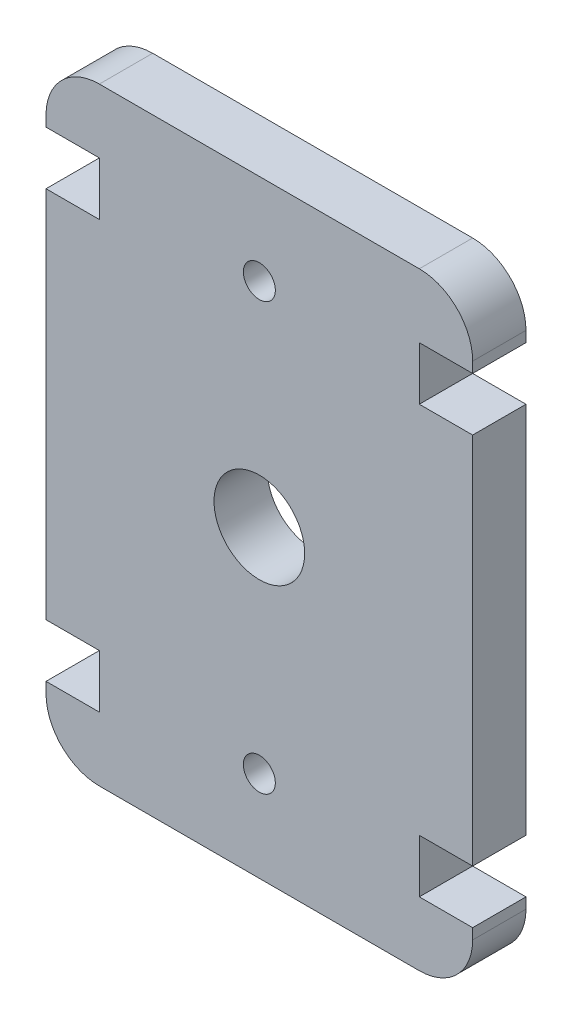
ISO-10303-21;
HEADER;
FILE_DESCRIPTION(('STEP AP214'),'2;1');
FILE_NAME('part.step','',(''),(''),'','','');
FILE_SCHEMA(('AUTOMOTIVE_DESIGN { 1 0 10303 214 1 1 1 1 }'));
ENDSEC;
DATA;
#1=APPLICATION_CONTEXT('core data for automotive mechanical design processes');
#2=APPLICATION_PROTOCOL_DEFINITION('international standard','automotive_design',2000,#1);
#3=PRODUCT_CONTEXT('',#1,'mechanical');
#4=PRODUCT('Part','Part','',(#3));
#5=PRODUCT_RELATED_PRODUCT_CATEGORY('part','',(#4));
#6=PRODUCT_DEFINITION_FORMATION('','',#4);
#7=PRODUCT_DEFINITION_CONTEXT('part definition',#1,'design');
#8=PRODUCT_DEFINITION('design','',#6,#7);
#9=PRODUCT_DEFINITION_SHAPE('','',#8);
#10=(LENGTH_UNIT() NAMED_UNIT(*) SI_UNIT(.MILLI.,.METRE.));
#11=(NAMED_UNIT(*) PLANE_ANGLE_UNIT() SI_UNIT($,.RADIAN.));
#12=(NAMED_UNIT(*) SI_UNIT($,.STERADIAN.) SOLID_ANGLE_UNIT());
#13=UNCERTAINTY_MEASURE_WITH_UNIT(LENGTH_MEASURE(1.E-05),#10,'distance_accuracy_value','');
#14=(GEOMETRIC_REPRESENTATION_CONTEXT(3) GLOBAL_UNCERTAINTY_ASSIGNED_CONTEXT((#13)) GLOBAL_UNIT_ASSIGNED_CONTEXT((#10,
#11,#12)) REPRESENTATION_CONTEXT('',''));
#15=CARTESIAN_POINT('',(0.,0.,0.));
#16=DIRECTION('',(0.,0.,1.));
#17=DIRECTION('',(1.,0.,0.));
#18=AXIS2_PLACEMENT_3D('',#15,#16,#17);
#19=CARTESIAN_POINT('',(0.,0.,5.));
#20=DIRECTION('',(0.,0.,1.));
#21=DIRECTION('',(1.,0.,0.));
#22=AXIS2_PLACEMENT_3D('',#19,#20,#21);
#23=PLANE('',#22);
#24=CARTESIAN_POINT('',(0.,8.50000000000009,5.));
#25=DIRECTION('',(0.,0.,1.));
#26=DIRECTION('',(1.,0.,0.));
#27=AXIS2_PLACEMENT_3D('',#24,#25,#26);
#28=CIRCLE('',#27,1.5);
#29=CARTESIAN_POINT('',(1.5,8.50000000000009,5.));
#30=VERTEX_POINT('',#29);
#31=EDGE_CURVE('E473',#30,#30,#28,.T.);
#32=ORIENTED_EDGE('',*,*,#31,.F.);
#33=EDGE_LOOP('',(#32));
#34=FACE_BOUND('',#33,.T.);
#35=DIRECTION('',(0.,1.,0.));
#36=VECTOR('',#35,1.);
#37=CARTESIAN_POINT('',(20.,51.,5.));
#38=LINE('',#37,#36);
#39=CARTESIAN_POINT('',(20.,51.,5.));
#40=VERTEX_POINT('',#39);
#41=CARTESIAN_POINT('',(20.,52.0000000000001,5.));
#42=VERTEX_POINT('',#41);
#43=EDGE_CURVE('E248',#40,#42,#38,.T.);
#44=ORIENTED_EDGE('',*,*,#43,.T.);
#45=CARTESIAN_POINT('',(15.,52.0000000000001,5.));
#46=DIRECTION('',(0.,0.,1.));
#47=DIRECTION('',(1.,0.,0.));
#48=AXIS2_PLACEMENT_3D('',#45,#46,#47);
#49=CIRCLE('',#48,5.);
#50=CARTESIAN_POINT('',(15.,57.0000000000001,5.));
#51=VERTEX_POINT('',#50);
#52=EDGE_CURVE('E429',#42,#51,#49,.T.);
#53=ORIENTED_EDGE('',*,*,#52,.T.);
#54=DIRECTION('',(-1.,0.,0.));
#55=VECTOR('',#54,1.);
#56=CARTESIAN_POINT('',(20.,57.0000000000001,5.));
#57=LINE('',#56,#55);
#58=CARTESIAN_POINT('',(-15.,57.0000000000001,5.));
#59=VERTEX_POINT('',#58);
#60=EDGE_CURVE('E251',#51,#59,#57,.T.);
#61=ORIENTED_EDGE('',*,*,#60,.T.);
#62=CARTESIAN_POINT('',(-15.,52.0000000000001,5.));
#63=DIRECTION('',(0.,0.,1.));
#64=DIRECTION('',(1.,0.,0.));
#65=AXIS2_PLACEMENT_3D('',#62,#63,#64);
#66=CIRCLE('',#65,5.);
#67=CARTESIAN_POINT('',(-20.,52.0000000000001,5.));
#68=VERTEX_POINT('',#67);
#69=EDGE_CURVE('E55',#59,#68,#66,.T.);
#70=ORIENTED_EDGE('',*,*,#69,.T.);
#71=DIRECTION('',(0.,-1.,0.));
#72=VECTOR('',#71,1.);
#73=CARTESIAN_POINT('',(-20.,57.0000000000001,5.));
#74=LINE('',#73,#72);
#75=CARTESIAN_POINT('',(-20.,51.,5.));
#76=VERTEX_POINT('',#75);
#77=EDGE_CURVE('E254',#68,#76,#74,.T.);
#78=ORIENTED_EDGE('',*,*,#77,.T.);
#79=DIRECTION('',(1.,0.,0.));
#80=VECTOR('',#79,1.);
#81=CARTESIAN_POINT('',(-20.,51.,5.));
#82=LINE('',#81,#80);
#83=CARTESIAN_POINT('',(-15.,51.,5.));
#84=VERTEX_POINT('',#83);
#85=EDGE_CURVE('E257',#76,#84,#82,.T.);
#86=ORIENTED_EDGE('',*,*,#85,.T.);
#87=DIRECTION('',(0.,-1.,0.));
#88=VECTOR('',#87,1.);
#89=CARTESIAN_POINT('',(-15.,51.,5.));
#90=LINE('',#89,#88);
#91=CARTESIAN_POINT('',(-15.,46.,5.));
#92=VERTEX_POINT('',#91);
#93=EDGE_CURVE('E260',#84,#92,#90,.T.);
#94=ORIENTED_EDGE('',*,*,#93,.T.);
#95=DIRECTION('',(-1.,0.,0.));
#96=VECTOR('',#95,1.);
#97=CARTESIAN_POINT('',(-15.,46.,5.));
#98=LINE('',#97,#96);
#99=CARTESIAN_POINT('',(-20.,46.,5.));
#100=VERTEX_POINT('',#99);
#101=EDGE_CURVE('E263',#92,#100,#98,.T.);
#102=ORIENTED_EDGE('',*,*,#101,.T.);
#103=DIRECTION('',(0.,-1.,0.));
#104=VECTOR('',#103,1.);
#105=CARTESIAN_POINT('',(-20.,46.,5.));
#106=LINE('',#105,#104);
#107=CARTESIAN_POINT('',(-20.,11.0000000000001,5.));
#108=VERTEX_POINT('',#107);
#109=EDGE_CURVE('E266',#100,#108,#106,.T.);
#110=ORIENTED_EDGE('',*,*,#109,.T.);
#111=DIRECTION('',(1.,0.,0.));
#112=VECTOR('',#111,1.);
#113=CARTESIAN_POINT('',(-20.,11.0000000000001,5.));
#114=LINE('',#113,#112);
#115=CARTESIAN_POINT('',(-15.,11.,5.));
#116=VERTEX_POINT('',#115);
#117=EDGE_CURVE('E269',#108,#116,#114,.T.);
#118=ORIENTED_EDGE('',*,*,#117,.T.);
#119=DIRECTION('',(0.,-1.,0.));
#120=VECTOR('',#119,1.);
#121=CARTESIAN_POINT('',(-15.,11.,5.));
#122=LINE('',#121,#120);
#123=CARTESIAN_POINT('',(-15.,6.,5.));
#124=VERTEX_POINT('',#123);
#125=EDGE_CURVE('E272',#116,#124,#122,.T.);
#126=ORIENTED_EDGE('',*,*,#125,.T.);
#127=DIRECTION('',(-1.,0.,0.));
#128=VECTOR('',#127,1.);
#129=CARTESIAN_POINT('',(-15.,6.,5.));
#130=LINE('',#129,#128);
#131=CARTESIAN_POINT('',(-20.,6.00000000000009,5.));
#132=VERTEX_POINT('',#131);
#133=EDGE_CURVE('E275',#124,#132,#130,.T.);
#134=ORIENTED_EDGE('',*,*,#133,.T.);
#135=DIRECTION('',(0.,-1.,0.));
#136=VECTOR('',#135,1.);
#137=CARTESIAN_POINT('',(-20.,6.00000000000009,5.));
#138=LINE('',#137,#136);
#139=CARTESIAN_POINT('',(-20.,5.,5.));
#140=VERTEX_POINT('',#139);
#141=EDGE_CURVE('E343',#132,#140,#138,.T.);
#142=ORIENTED_EDGE('',*,*,#141,.T.);
#143=CARTESIAN_POINT('',(-15.,5.,5.));
#144=DIRECTION('',(0.,0.,1.));
#145=DIRECTION('',(1.,0.,0.));
#146=AXIS2_PLACEMENT_3D('',#143,#144,#145);
#147=CIRCLE('',#146,5.);
#148=CARTESIAN_POINT('',(-15.,0.,5.));
#149=VERTEX_POINT('',#148);
#150=EDGE_CURVE('E424',#140,#149,#147,.T.);
#151=ORIENTED_EDGE('',*,*,#150,.T.);
#152=DIRECTION('',(1.,0.,0.));
#153=VECTOR('',#152,1.);
#154=CARTESIAN_POINT('',(-20.,0.,5.));
#155=LINE('',#154,#153);
#156=CARTESIAN_POINT('',(15.,0.,5.));
#157=VERTEX_POINT('',#156);
#158=EDGE_CURVE('E210',#149,#157,#155,.T.);
#159=ORIENTED_EDGE('',*,*,#158,.T.);
#160=CARTESIAN_POINT('',(15.,5.,5.));
#161=DIRECTION('',(0.,0.,1.));
#162=DIRECTION('',(1.,0.,0.));
#163=AXIS2_PLACEMENT_3D('',#160,#161,#162);
#164=CIRCLE('',#163,5.);
#165=CARTESIAN_POINT('',(20.,5.,5.));
#166=VERTEX_POINT('',#165);
#167=EDGE_CURVE('E62',#157,#166,#164,.T.);
#168=ORIENTED_EDGE('',*,*,#167,.T.);
#169=DIRECTION('',(0.,1.,0.));
#170=VECTOR('',#169,1.);
#171=CARTESIAN_POINT('',(20.,0.,5.));
#172=LINE('',#171,#170);
#173=CARTESIAN_POINT('',(20.,6.0000000000001,5.));
#174=VERTEX_POINT('',#173);
#175=EDGE_CURVE('E199',#166,#174,#172,.T.);
#176=ORIENTED_EDGE('',*,*,#175,.T.);
#177=DIRECTION('',(-1.,0.,0.));
#178=VECTOR('',#177,1.);
#179=CARTESIAN_POINT('',(20.,6.0000000000001,5.));
#180=LINE('',#179,#178);
#181=CARTESIAN_POINT('',(15.,6.,5.));
#182=VERTEX_POINT('',#181);
#183=EDGE_CURVE('E204',#174,#182,#180,.T.);
#184=ORIENTED_EDGE('',*,*,#183,.T.);
#185=DIRECTION('',(0.,1.,0.));
#186=VECTOR('',#185,1.);
#187=CARTESIAN_POINT('',(15.,6.,5.));
#188=LINE('',#187,#186);
#189=CARTESIAN_POINT('',(15.,11.,5.));
#190=VERTEX_POINT('',#189);
#191=EDGE_CURVE('E227',#182,#190,#188,.T.);
#192=ORIENTED_EDGE('',*,*,#191,.T.);
#193=DIRECTION('',(1.,0.,0.));
#194=VECTOR('',#193,1.);
#195=CARTESIAN_POINT('',(15.,11.,5.));
#196=LINE('',#195,#194);
#197=CARTESIAN_POINT('',(20.,11.0000000000001,5.));
#198=VERTEX_POINT('',#197);
#199=EDGE_CURVE('E230',#190,#198,#196,.T.);
#200=ORIENTED_EDGE('',*,*,#199,.T.);
#201=DIRECTION('',(0.,1.,0.));
#202=VECTOR('',#201,1.);
#203=CARTESIAN_POINT('',(20.,11.0000000000001,5.));
#204=LINE('',#203,#202);
#205=CARTESIAN_POINT('',(20.,46.,5.));
#206=VERTEX_POINT('',#205);
#207=EDGE_CURVE('E236',#198,#206,#204,.T.);
#208=ORIENTED_EDGE('',*,*,#207,.T.);
#209=DIRECTION('',(-1.,0.,0.));
#210=VECTOR('',#209,1.);
#211=CARTESIAN_POINT('',(20.,46.,5.));
#212=LINE('',#211,#210);
#213=CARTESIAN_POINT('',(15.,46.,5.));
#214=VERTEX_POINT('',#213);
#215=EDGE_CURVE('E239',#206,#214,#212,.T.);
#216=ORIENTED_EDGE('',*,*,#215,.T.);
#217=DIRECTION('',(0.,1.,0.));
#218=VECTOR('',#217,1.);
#219=CARTESIAN_POINT('',(15.,46.,5.));
#220=LINE('',#219,#218);
#221=CARTESIAN_POINT('',(15.,51.,5.));
#222=VERTEX_POINT('',#221);
#223=EDGE_CURVE('E242',#214,#222,#220,.T.);
#224=ORIENTED_EDGE('',*,*,#223,.T.);
#225=DIRECTION('',(1.,0.,0.));
#226=VECTOR('',#225,1.);
#227=CARTESIAN_POINT('',(15.,51.,5.));
#228=LINE('',#227,#226);
#229=EDGE_CURVE('E245',#222,#40,#228,.T.);
#230=ORIENTED_EDGE('',*,*,#229,.T.);
#231=EDGE_LOOP('',(#44,#53,#61,#70,#78,#86,#94,#102,#110,#118,#126,#134,#142,#151,#159,#168,
#176,#184,#192,#200,#208,#216,#224,#230));
#232=FACE_BOUND('',#231,.T.);
#233=CARTESIAN_POINT('',(0.,48.5,5.));
#234=DIRECTION('',(0.,0.,1.));
#235=DIRECTION('',(1.,0.,0.));
#236=AXIS2_PLACEMENT_3D('',#233,#234,#235);
#237=CIRCLE('',#236,1.5);
#238=CARTESIAN_POINT('',(1.5,48.5,5.));
#239=VERTEX_POINT('',#238);
#240=EDGE_CURVE('E284',#239,#239,#237,.T.);
#241=ORIENTED_EDGE('',*,*,#240,.F.);
#242=EDGE_LOOP('',(#241));
#243=FACE_BOUND('',#242,.T.);
#244=CARTESIAN_POINT('',(0.,28.5,5.));
#245=DIRECTION('',(0.,0.,1.));
#246=DIRECTION('',(1.,0.,0.));
#247=AXIS2_PLACEMENT_3D('',#244,#245,#246);
#248=CIRCLE('',#247,4.25);
#249=CARTESIAN_POINT('',(4.25,28.5,5.));
#250=VERTEX_POINT('',#249);
#251=EDGE_CURVE('E481',#250,#250,#248,.T.);
#252=ORIENTED_EDGE('',*,*,#251,.F.);
#253=EDGE_LOOP('',(#252));
#254=FACE_BOUND('',#253,.T.);
#255=ADVANCED_FACE('F39',(#34,#232,#243,#254),#23,.T.);
#256=CARTESIAN_POINT('',(0.,0.,0.));
#257=DIRECTION('',(0.,0.,1.));
#258=DIRECTION('',(1.,0.,0.));
#259=AXIS2_PLACEMENT_3D('',#256,#257,#258);
#260=PLANE('',#259);
#261=DIRECTION('',(-1.,0.,0.));
#262=VECTOR('',#261,1.);
#263=CARTESIAN_POINT('',(20.,57.0000000000001,0.));
#264=LINE('',#263,#262);
#265=CARTESIAN_POINT('',(15.,57.0000000000001,0.));
#266=VERTEX_POINT('',#265);
#267=CARTESIAN_POINT('',(-15.,57.0000000000001,0.));
#268=VERTEX_POINT('',#267);
#269=EDGE_CURVE('E315',#266,#268,#264,.T.);
#270=ORIENTED_EDGE('',*,*,#269,.F.);
#271=CARTESIAN_POINT('',(15.,52.0000000000001,0.));
#272=DIRECTION('',(0.,0.,1.));
#273=DIRECTION('',(1.,0.,0.));
#274=AXIS2_PLACEMENT_3D('',#271,#272,#273);
#275=CIRCLE('',#274,5.);
#276=CARTESIAN_POINT('',(20.,52.0000000000001,0.));
#277=VERTEX_POINT('',#276);
#278=EDGE_CURVE('E416',#266,#277,#275,.F.);
#279=ORIENTED_EDGE('',*,*,#278,.T.);
#280=DIRECTION('',(0.,1.,0.));
#281=VECTOR('',#280,1.);
#282=CARTESIAN_POINT('',(20.,51.,0.));
#283=LINE('',#282,#281);
#284=CARTESIAN_POINT('',(20.,51.,0.));
#285=VERTEX_POINT('',#284);
#286=EDGE_CURVE('E311',#285,#277,#283,.T.);
#287=ORIENTED_EDGE('',*,*,#286,.F.);
#288=DIRECTION('',(1.,0.,0.));
#289=VECTOR('',#288,1.);
#290=CARTESIAN_POINT('',(15.,51.,0.));
#291=LINE('',#290,#289);
#292=CARTESIAN_POINT('',(15.,51.,0.));
#293=VERTEX_POINT('',#292);
#294=EDGE_CURVE('E308',#293,#285,#291,.T.);
#295=ORIENTED_EDGE('',*,*,#294,.F.);
#296=DIRECTION('',(0.,1.,0.));
#297=VECTOR('',#296,1.);
#298=CARTESIAN_POINT('',(15.,46.,0.));
#299=LINE('',#298,#297);
#300=CARTESIAN_POINT('',(15.,46.,0.));
#301=VERTEX_POINT('',#300);
#302=EDGE_CURVE('E305',#301,#293,#299,.T.);
#303=ORIENTED_EDGE('',*,*,#302,.F.);
#304=DIRECTION('',(-1.,0.,0.));
#305=VECTOR('',#304,1.);
#306=CARTESIAN_POINT('',(20.,46.,0.));
#307=LINE('',#306,#305);
#308=CARTESIAN_POINT('',(20.,46.,0.));
#309=VERTEX_POINT('',#308);
#310=EDGE_CURVE('E302',#309,#301,#307,.T.);
#311=ORIENTED_EDGE('',*,*,#310,.F.);
#312=DIRECTION('',(0.,1.,0.));
#313=VECTOR('',#312,1.);
#314=CARTESIAN_POINT('',(20.,11.0000000000001,0.));
#315=LINE('',#314,#313);
#316=CARTESIAN_POINT('',(20.,11.0000000000001,0.));
#317=VERTEX_POINT('',#316);
#318=EDGE_CURVE('E299',#317,#309,#315,.T.);
#319=ORIENTED_EDGE('',*,*,#318,.F.);
#320=DIRECTION('',(1.,0.,0.));
#321=VECTOR('',#320,1.);
#322=CARTESIAN_POINT('',(15.,11.,0.));
#323=LINE('',#322,#321);
#324=CARTESIAN_POINT('',(15.,11.,0.));
#325=VERTEX_POINT('',#324);
#326=EDGE_CURVE('E296',#325,#317,#323,.T.);
#327=ORIENTED_EDGE('',*,*,#326,.F.);
#328=DIRECTION('',(0.,1.,0.));
#329=VECTOR('',#328,1.);
#330=CARTESIAN_POINT('',(15.,6.,0.));
#331=LINE('',#330,#329);
#332=CARTESIAN_POINT('',(15.,6.,0.));
#333=VERTEX_POINT('',#332);
#334=EDGE_CURVE('E293',#333,#325,#331,.T.);
#335=ORIENTED_EDGE('',*,*,#334,.F.);
#336=DIRECTION('',(-1.,0.,0.));
#337=VECTOR('',#336,1.);
#338=CARTESIAN_POINT('',(20.,6.0000000000001,0.));
#339=LINE('',#338,#337);
#340=CARTESIAN_POINT('',(20.,6.0000000000001,0.));
#341=VERTEX_POINT('',#340);
#342=EDGE_CURVE('E290',#341,#333,#339,.T.);
#343=ORIENTED_EDGE('',*,*,#342,.F.);
#344=DIRECTION('',(0.,1.,0.));
#345=VECTOR('',#344,1.);
#346=CARTESIAN_POINT('',(20.,0.,0.));
#347=LINE('',#346,#345);
#348=CARTESIAN_POINT('',(20.,5.,0.));
#349=VERTEX_POINT('',#348);
#350=EDGE_CURVE('E216',#349,#341,#347,.T.);
#351=ORIENTED_EDGE('',*,*,#350,.F.);
#352=CARTESIAN_POINT('',(15.,5.,0.));
#353=DIRECTION('',(0.,0.,1.));
#354=DIRECTION('',(1.,0.,0.));
#355=AXIS2_PLACEMENT_3D('',#352,#353,#354);
#356=CIRCLE('',#355,5.);
#357=CARTESIAN_POINT('',(15.,0.,0.));
#358=VERTEX_POINT('',#357);
#359=EDGE_CURVE('E413',#349,#358,#356,.F.);
#360=ORIENTED_EDGE('',*,*,#359,.T.);
#361=DIRECTION('',(1.,0.,0.));
#362=VECTOR('',#361,1.);
#363=CARTESIAN_POINT('',(-20.,0.,0.));
#364=LINE('',#363,#362);
#365=CARTESIAN_POINT('',(-15.,0.,0.));
#366=VERTEX_POINT('',#365);
#367=EDGE_CURVE('E283',#366,#358,#364,.T.);
#368=ORIENTED_EDGE('',*,*,#367,.F.);
#369=CARTESIAN_POINT('',(-15.,5.,0.));
#370=DIRECTION('',(0.,0.,1.));
#371=DIRECTION('',(1.,0.,0.));
#372=AXIS2_PLACEMENT_3D('',#369,#370,#371);
#373=CIRCLE('',#372,5.);
#374=CARTESIAN_POINT('',(-20.,5.,0.));
#375=VERTEX_POINT('',#374);
#376=EDGE_CURVE('E410',#366,#375,#373,.F.);
#377=ORIENTED_EDGE('',*,*,#376,.T.);
#378=DIRECTION('',(0.,-1.,0.));
#379=VECTOR('',#378,1.);
#380=CARTESIAN_POINT('',(-20.,6.00000000000009,0.));
#381=LINE('',#380,#379);
#382=CARTESIAN_POINT('',(-20.,6.00000000000009,0.));
#383=VERTEX_POINT('',#382);
#384=EDGE_CURVE('E279',#383,#375,#381,.T.);
#385=ORIENTED_EDGE('',*,*,#384,.F.);
#386=DIRECTION('',(-1.,0.,0.));
#387=VECTOR('',#386,1.);
#388=CARTESIAN_POINT('',(-15.,6.,0.));
#389=LINE('',#388,#387);
#390=CARTESIAN_POINT('',(-15.,6.,0.));
#391=VERTEX_POINT('',#390);
#392=EDGE_CURVE('E340',#391,#383,#389,.T.);
#393=ORIENTED_EDGE('',*,*,#392,.F.);
#394=DIRECTION('',(0.,-1.,0.));
#395=VECTOR('',#394,1.);
#396=CARTESIAN_POINT('',(-15.,11.,0.));
#397=LINE('',#396,#395);
#398=CARTESIAN_POINT('',(-15.,11.,0.));
#399=VERTEX_POINT('',#398);
#400=EDGE_CURVE('E337',#399,#391,#397,.T.);
#401=ORIENTED_EDGE('',*,*,#400,.F.);
#402=DIRECTION('',(1.,0.,0.));
#403=VECTOR('',#402,1.);
#404=CARTESIAN_POINT('',(-20.,11.0000000000001,0.));
#405=LINE('',#404,#403);
#406=CARTESIAN_POINT('',(-20.,11.0000000000001,0.));
#407=VERTEX_POINT('',#406);
#408=EDGE_CURVE('E334',#407,#399,#405,.T.);
#409=ORIENTED_EDGE('',*,*,#408,.F.);
#410=DIRECTION('',(0.,-1.,0.));
#411=VECTOR('',#410,1.);
#412=CARTESIAN_POINT('',(-20.,46.,0.));
#413=LINE('',#412,#411);
#414=CARTESIAN_POINT('',(-20.,46.,0.));
#415=VERTEX_POINT('',#414);
#416=EDGE_CURVE('E331',#415,#407,#413,.T.);
#417=ORIENTED_EDGE('',*,*,#416,.F.);
#418=DIRECTION('',(-1.,0.,0.));
#419=VECTOR('',#418,1.);
#420=CARTESIAN_POINT('',(-15.,46.,0.));
#421=LINE('',#420,#419);
#422=CARTESIAN_POINT('',(-15.,46.,0.));
#423=VERTEX_POINT('',#422);
#424=EDGE_CURVE('E328',#423,#415,#421,.T.);
#425=ORIENTED_EDGE('',*,*,#424,.F.);
#426=DIRECTION('',(0.,-1.,0.));
#427=VECTOR('',#426,1.);
#428=CARTESIAN_POINT('',(-15.,51.,0.));
#429=LINE('',#428,#427);
#430=CARTESIAN_POINT('',(-15.,51.,0.));
#431=VERTEX_POINT('',#430);
#432=EDGE_CURVE('E325',#431,#423,#429,.T.);
#433=ORIENTED_EDGE('',*,*,#432,.F.);
#434=DIRECTION('',(1.,0.,0.));
#435=VECTOR('',#434,1.);
#436=CARTESIAN_POINT('',(-20.,51.,0.));
#437=LINE('',#436,#435);
#438=CARTESIAN_POINT('',(-20.,51.,0.));
#439=VERTEX_POINT('',#438);
#440=EDGE_CURVE('E322',#439,#431,#437,.T.);
#441=ORIENTED_EDGE('',*,*,#440,.F.);
#442=DIRECTION('',(0.,-1.,0.));
#443=VECTOR('',#442,1.);
#444=CARTESIAN_POINT('',(-20.,57.0000000000001,0.));
#445=LINE('',#444,#443);
#446=CARTESIAN_POINT('',(-20.,52.0000000000001,0.));
#447=VERTEX_POINT('',#446);
#448=EDGE_CURVE('E319',#447,#439,#445,.T.);
#449=ORIENTED_EDGE('',*,*,#448,.F.);
#450=CARTESIAN_POINT('',(-15.,52.0000000000001,0.));
#451=DIRECTION('',(0.,0.,1.));
#452=DIRECTION('',(1.,0.,0.));
#453=AXIS2_PLACEMENT_3D('',#450,#451,#452);
#454=CIRCLE('',#453,5.);
#455=EDGE_CURVE('E407',#447,#268,#454,.F.);
#456=ORIENTED_EDGE('',*,*,#455,.T.);
#457=EDGE_LOOP('',(#270,#279,#287,#295,#303,#311,#319,#327,#335,#343,#351,#360,#368,#377,#385,
#393,#401,#409,#417,#425,#433,#441,#449,#456));
#458=FACE_BOUND('',#457,.T.);
#459=CARTESIAN_POINT('',(0.,48.5,0.));
#460=DIRECTION('',(0.,0.,1.));
#461=DIRECTION('',(1.,0.,0.));
#462=AXIS2_PLACEMENT_3D('',#459,#460,#461);
#463=CIRCLE('',#462,1.5);
#464=CARTESIAN_POINT('',(1.5,48.5,0.));
#465=VERTEX_POINT('',#464);
#466=EDGE_CURVE('E469',#465,#465,#463,.T.);
#467=ORIENTED_EDGE('',*,*,#466,.T.);
#468=EDGE_LOOP('',(#467));
#469=FACE_BOUND('',#468,.T.);
#470=CARTESIAN_POINT('',(0.,8.50000000000009,0.));
#471=DIRECTION('',(0.,0.,1.));
#472=DIRECTION('',(1.,0.,0.));
#473=AXIS2_PLACEMENT_3D('',#470,#471,#472);
#474=CIRCLE('',#473,1.5);
#475=CARTESIAN_POINT('',(1.5,8.50000000000009,0.));
#476=VERTEX_POINT('',#475);
#477=EDGE_CURVE('E477',#476,#476,#474,.T.);
#478=ORIENTED_EDGE('',*,*,#477,.T.);
#479=EDGE_LOOP('',(#478));
#480=FACE_BOUND('',#479,.T.);
#481=CARTESIAN_POINT('',(0.,28.5,0.));
#482=DIRECTION('',(0.,0.,1.));
#483=DIRECTION('',(1.,0.,0.));
#484=AXIS2_PLACEMENT_3D('',#481,#482,#483);
#485=CIRCLE('',#484,4.25);
#486=CARTESIAN_POINT('',(4.25,28.5,0.));
#487=VERTEX_POINT('',#486);
#488=EDGE_CURVE('E485',#487,#487,#485,.T.);
#489=ORIENTED_EDGE('',*,*,#488,.T.);
#490=EDGE_LOOP('',(#489));
#491=FACE_BOUND('',#490,.T.);
#492=ADVANCED_FACE('F463',(#458,#469,#480,#491),#260,.F.);
#493=CARTESIAN_POINT('',(-20.,6.00000000000009,5.));
#494=DIRECTION('',(1.,0.,0.));
#495=DIRECTION('',(0.,0.,-1.));
#496=AXIS2_PLACEMENT_3D('',#493,#494,#495);
#497=PLANE('',#496);
#498=ORIENTED_EDGE('',*,*,#384,.T.);
#499=DIRECTION('',(0.,0.,-1.));
#500=VECTOR('',#499,1.);
#501=CARTESIAN_POINT('',(-20.,5.,5.));
#502=LINE('',#501,#500);
#503=EDGE_CURVE('E48',#375,#140,#502,.F.);
#504=ORIENTED_EDGE('',*,*,#503,.T.);
#505=ORIENTED_EDGE('',*,*,#141,.F.);
#506=DIRECTION('',(0.,0.,-1.));
#507=VECTOR('',#506,1.);
#508=CARTESIAN_POINT('',(-20.,6.00000000000009,5.));
#509=LINE('',#508,#507);
#510=EDGE_CURVE('E278',#132,#383,#509,.T.);
#511=ORIENTED_EDGE('',*,*,#510,.T.);
#512=EDGE_LOOP('',(#498,#504,#505,#511));
#513=FACE_BOUND('',#512,.T.);
#514=ADVANCED_FACE('F446',(#513),#497,.F.);
#515=CARTESIAN_POINT('',(-20.,0.,5.));
#516=DIRECTION('',(0.,1.,0.));
#517=DIRECTION('',(0.,0.,1.));
#518=AXIS2_PLACEMENT_3D('',#515,#516,#517);
#519=PLANE('',#518);
#520=ORIENTED_EDGE('',*,*,#367,.T.);
#521=DIRECTION('',(0.,0.,-1.));
#522=VECTOR('',#521,1.);
#523=CARTESIAN_POINT('',(15.,0.,5.));
#524=LINE('',#523,#522);
#525=EDGE_CURVE('E439',#358,#157,#524,.F.);
#526=ORIENTED_EDGE('',*,*,#525,.T.);
#527=ORIENTED_EDGE('',*,*,#158,.F.);
#528=DIRECTION('',(0.,0.,-1.));
#529=VECTOR('',#528,1.);
#530=CARTESIAN_POINT('',(-15.,0.,5.));
#531=LINE('',#530,#529);
#532=EDGE_CURVE('E435',#149,#366,#531,.T.);
#533=ORIENTED_EDGE('',*,*,#532,.T.);
#534=EDGE_LOOP('',(#520,#526,#527,#533));
#535=FACE_BOUND('',#534,.T.);
#536=ADVANCED_FACE('F459',(#535),#519,.F.);
#537=CARTESIAN_POINT('',(20.,0.,5.));
#538=DIRECTION('',(-1.,0.,0.));
#539=DIRECTION('',(0.,0.,1.));
#540=AXIS2_PLACEMENT_3D('',#537,#538,#539);
#541=PLANE('',#540);
#542=ORIENTED_EDGE('',*,*,#175,.F.);
#543=DIRECTION('',(0.,0.,-1.));
#544=VECTOR('',#543,1.);
#545=CARTESIAN_POINT('',(20.,5.,5.));
#546=LINE('',#545,#544);
#547=EDGE_CURVE('E432',#166,#349,#546,.T.);
#548=ORIENTED_EDGE('',*,*,#547,.T.);
#549=ORIENTED_EDGE('',*,*,#350,.T.);
#550=DIRECTION('',(0.,0.,-1.));
#551=VECTOR('',#550,1.);
#552=CARTESIAN_POINT('',(20.,6.0000000000001,5.));
#553=LINE('',#552,#551);
#554=EDGE_CURVE('E213',#174,#341,#553,.T.);
#555=ORIENTED_EDGE('',*,*,#554,.F.);
#556=EDGE_LOOP('',(#542,#548,#549,#555));
#557=FACE_BOUND('',#556,.T.);
#558=ADVANCED_FACE('F214',(#557),#541,.F.);
#559=CARTESIAN_POINT('',(20.,6.0000000000001,5.));
#560=DIRECTION('',(0.,-1.,0.));
#561=DIRECTION('',(1.,0.,0.));
#562=AXIS2_PLACEMENT_3D('',#559,#560,#561);
#563=PLANE('',#562);
#564=ORIENTED_EDGE('',*,*,#342,.T.);
#565=DIRECTION('',(0.,0.,-1.));
#566=VECTOR('',#565,1.);
#567=CARTESIAN_POINT('',(15.,6.,5.));
#568=LINE('',#567,#566);
#569=EDGE_CURVE('E221',#182,#333,#568,.T.);
#570=ORIENTED_EDGE('',*,*,#569,.F.);
#571=ORIENTED_EDGE('',*,*,#183,.F.);
#572=ORIENTED_EDGE('',*,*,#554,.T.);
#573=EDGE_LOOP('',(#564,#570,#571,#572));
#574=FACE_BOUND('',#573,.T.);
#575=ADVANCED_FACE('F223',(#574),#563,.F.);
#576=CARTESIAN_POINT('',(15.,6.,5.));
#577=DIRECTION('',(-1.,0.,0.));
#578=DIRECTION('',(0.,0.,1.));
#579=AXIS2_PLACEMENT_3D('',#576,#577,#578);
#580=PLANE('',#579);
#581=ORIENTED_EDGE('',*,*,#334,.T.);
#582=DIRECTION('',(0.,0.,-1.));
#583=VECTOR('',#582,1.);
#584=CARTESIAN_POINT('',(15.,11.,5.));
#585=LINE('',#584,#583);
#586=EDGE_CURVE('E395',#190,#325,#585,.T.);
#587=ORIENTED_EDGE('',*,*,#586,.F.);
#588=ORIENTED_EDGE('',*,*,#191,.F.);
#589=ORIENTED_EDGE('',*,*,#569,.T.);
#590=EDGE_LOOP('',(#581,#587,#588,#589));
#591=FACE_BOUND('',#590,.T.);
#592=ADVANCED_FACE('F567',(#591),#580,.F.);
#593=CARTESIAN_POINT('',(15.,11.,5.));
#594=DIRECTION('',(0.,1.,0.));
#595=DIRECTION('',(-1.,0.,0.));
#596=AXIS2_PLACEMENT_3D('',#593,#594,#595);
#597=PLANE('',#596);
#598=ORIENTED_EDGE('',*,*,#326,.T.);
#599=DIRECTION('',(0.,0.,-1.));
#600=VECTOR('',#599,1.);
#601=CARTESIAN_POINT('',(20.,11.0000000000001,5.));
#602=LINE('',#601,#600);
#603=EDGE_CURVE('E391',#198,#317,#602,.T.);
#604=ORIENTED_EDGE('',*,*,#603,.F.);
#605=ORIENTED_EDGE('',*,*,#199,.F.);
#606=ORIENTED_EDGE('',*,*,#586,.T.);
#607=EDGE_LOOP('',(#598,#604,#605,#606));
#608=FACE_BOUND('',#607,.T.);
#609=ADVANCED_FACE('F563',(#608),#597,.F.);
#610=CARTESIAN_POINT('',(20.,11.0000000000001,5.));
#611=DIRECTION('',(-1.,0.,0.));
#612=DIRECTION('',(0.,0.,1.));
#613=AXIS2_PLACEMENT_3D('',#610,#611,#612);
#614=PLANE('',#613);
#615=ORIENTED_EDGE('',*,*,#318,.T.);
#616=DIRECTION('',(0.,0.,-1.));
#617=VECTOR('',#616,1.);
#618=CARTESIAN_POINT('',(20.,46.,5.));
#619=LINE('',#618,#617);
#620=EDGE_CURVE('E387',#206,#309,#619,.T.);
#621=ORIENTED_EDGE('',*,*,#620,.F.);
#622=ORIENTED_EDGE('',*,*,#207,.F.);
#623=ORIENTED_EDGE('',*,*,#603,.T.);
#624=EDGE_LOOP('',(#615,#621,#622,#623));
#625=FACE_BOUND('',#624,.T.);
#626=ADVANCED_FACE('F559',(#625),#614,.F.);
#627=CARTESIAN_POINT('',(20.,46.,5.));
#628=DIRECTION('',(0.,-1.,0.));
#629=DIRECTION('',(0.,0.,-1.));
#630=AXIS2_PLACEMENT_3D('',#627,#628,#629);
#631=PLANE('',#630);
#632=ORIENTED_EDGE('',*,*,#310,.T.);
#633=DIRECTION('',(0.,0.,-1.));
#634=VECTOR('',#633,1.);
#635=CARTESIAN_POINT('',(15.,46.,5.));
#636=LINE('',#635,#634);
#637=EDGE_CURVE('E383',#214,#301,#636,.T.);
#638=ORIENTED_EDGE('',*,*,#637,.F.);
#639=ORIENTED_EDGE('',*,*,#215,.F.);
#640=ORIENTED_EDGE('',*,*,#620,.T.);
#641=EDGE_LOOP('',(#632,#638,#639,#640));
#642=FACE_BOUND('',#641,.T.);
#643=ADVANCED_FACE('F555',(#642),#631,.F.);
#644=CARTESIAN_POINT('',(15.,46.,5.));
#645=DIRECTION('',(-1.,0.,0.));
#646=DIRECTION('',(0.,0.,1.));
#647=AXIS2_PLACEMENT_3D('',#644,#645,#646);
#648=PLANE('',#647);
#649=ORIENTED_EDGE('',*,*,#302,.T.);
#650=DIRECTION('',(0.,0.,-1.));
#651=VECTOR('',#650,1.);
#652=CARTESIAN_POINT('',(15.,51.,5.));
#653=LINE('',#652,#651);
#654=EDGE_CURVE('E379',#222,#293,#653,.T.);
#655=ORIENTED_EDGE('',*,*,#654,.F.);
#656=ORIENTED_EDGE('',*,*,#223,.F.);
#657=ORIENTED_EDGE('',*,*,#637,.T.);
#658=EDGE_LOOP('',(#649,#655,#656,#657));
#659=FACE_BOUND('',#658,.T.);
#660=ADVANCED_FACE('F551',(#659),#648,.F.);
#661=CARTESIAN_POINT('',(15.,51.,5.));
#662=DIRECTION('',(0.,1.,0.));
#663=DIRECTION('',(-1.,0.,0.));
#664=AXIS2_PLACEMENT_3D('',#661,#662,#663);
#665=PLANE('',#664);
#666=ORIENTED_EDGE('',*,*,#294,.T.);
#667=DIRECTION('',(0.,0.,-1.));
#668=VECTOR('',#667,1.);
#669=CARTESIAN_POINT('',(20.,51.,5.));
#670=LINE('',#669,#668);
#671=EDGE_CURVE('E375',#40,#285,#670,.T.);
#672=ORIENTED_EDGE('',*,*,#671,.F.);
#673=ORIENTED_EDGE('',*,*,#229,.F.);
#674=ORIENTED_EDGE('',*,*,#654,.T.);
#675=EDGE_LOOP('',(#666,#672,#673,#674));
#676=FACE_BOUND('',#675,.T.);
#677=ADVANCED_FACE('F547',(#676),#665,.F.);
#678=CARTESIAN_POINT('',(20.,51.,5.));
#679=DIRECTION('',(-1.,0.,0.));
#680=DIRECTION('',(0.,0.,1.));
#681=AXIS2_PLACEMENT_3D('',#678,#679,#680);
#682=PLANE('',#681);
#683=ORIENTED_EDGE('',*,*,#286,.T.);
#684=DIRECTION('',(0.,0.,-1.));
#685=VECTOR('',#684,1.);
#686=CARTESIAN_POINT('',(20.,52.0000000000001,5.));
#687=LINE('',#686,#685);
#688=EDGE_CURVE('E419',#277,#42,#687,.F.);
#689=ORIENTED_EDGE('',*,*,#688,.T.);
#690=ORIENTED_EDGE('',*,*,#43,.F.);
#691=ORIENTED_EDGE('',*,*,#671,.T.);
#692=EDGE_LOOP('',(#683,#689,#690,#691));
#693=FACE_BOUND('',#692,.T.);
#694=ADVANCED_FACE('F543',(#693),#682,.F.);
#695=CARTESIAN_POINT('',(20.,57.0000000000001,5.));
#696=DIRECTION('',(0.,-1.,0.));
#697=DIRECTION('',(0.,0.,-1.));
#698=AXIS2_PLACEMENT_3D('',#695,#696,#697);
#699=PLANE('',#698);
#700=ORIENTED_EDGE('',*,*,#60,.F.);
#701=DIRECTION('',(0.,0.,-1.));
#702=VECTOR('',#701,1.);
#703=CARTESIAN_POINT('',(15.,57.0000000000001,5.));
#704=LINE('',#703,#702);
#705=EDGE_CURVE('E403',#51,#266,#704,.T.);
#706=ORIENTED_EDGE('',*,*,#705,.T.);
#707=ORIENTED_EDGE('',*,*,#269,.T.);
#708=DIRECTION('',(0.,0.,-1.));
#709=VECTOR('',#708,1.);
#710=CARTESIAN_POINT('',(-15.,57.0000000000001,5.));
#711=LINE('',#710,#709);
#712=EDGE_CURVE('E220',#268,#59,#711,.F.);
#713=ORIENTED_EDGE('',*,*,#712,.T.);
#714=EDGE_LOOP('',(#700,#706,#707,#713));
#715=FACE_BOUND('',#714,.T.);
#716=ADVANCED_FACE('F539',(#715),#699,.F.);
#717=CARTESIAN_POINT('',(-20.,57.0000000000001,5.));
#718=DIRECTION('',(1.,0.,0.));
#719=DIRECTION('',(0.,0.,-1.));
#720=AXIS2_PLACEMENT_3D('',#717,#718,#719);
#721=PLANE('',#720);
#722=ORIENTED_EDGE('',*,*,#77,.F.);
#723=DIRECTION('',(0.,0.,-1.));
#724=VECTOR('',#723,1.);
#725=CARTESIAN_POINT('',(-20.,52.0000000000001,5.));
#726=LINE('',#725,#724);
#727=EDGE_CURVE('E11',#68,#447,#726,.T.);
#728=ORIENTED_EDGE('',*,*,#727,.T.);
#729=ORIENTED_EDGE('',*,*,#448,.T.);
#730=DIRECTION('',(0.,0.,-1.));
#731=VECTOR('',#730,1.);
#732=CARTESIAN_POINT('',(-20.,51.,5.));
#733=LINE('',#732,#731);
#734=EDGE_CURVE('E371',#76,#439,#733,.T.);
#735=ORIENTED_EDGE('',*,*,#734,.F.);
#736=EDGE_LOOP('',(#722,#728,#729,#735));
#737=FACE_BOUND('',#736,.T.);
#738=ADVANCED_FACE('F535',(#737),#721,.F.);
#739=CARTESIAN_POINT('',(-20.,51.,5.));
#740=DIRECTION('',(0.,1.,0.));
#741=DIRECTION('',(-1.,0.,0.));
#742=AXIS2_PLACEMENT_3D('',#739,#740,#741);
#743=PLANE('',#742);
#744=ORIENTED_EDGE('',*,*,#440,.T.);
#745=DIRECTION('',(0.,0.,-1.));
#746=VECTOR('',#745,1.);
#747=CARTESIAN_POINT('',(-15.,51.,5.));
#748=LINE('',#747,#746);
#749=EDGE_CURVE('E367',#84,#431,#748,.T.);
#750=ORIENTED_EDGE('',*,*,#749,.F.);
#751=ORIENTED_EDGE('',*,*,#85,.F.);
#752=ORIENTED_EDGE('',*,*,#734,.T.);
#753=EDGE_LOOP('',(#744,#750,#751,#752));
#754=FACE_BOUND('',#753,.T.);
#755=ADVANCED_FACE('F531',(#754),#743,.F.);
#756=CARTESIAN_POINT('',(-15.,51.,5.));
#757=DIRECTION('',(1.,0.,0.));
#758=DIRECTION('',(0.,0.,-1.));
#759=AXIS2_PLACEMENT_3D('',#756,#757,#758);
#760=PLANE('',#759);
#761=ORIENTED_EDGE('',*,*,#432,.T.);
#762=DIRECTION('',(0.,0.,-1.));
#763=VECTOR('',#762,1.);
#764=CARTESIAN_POINT('',(-15.,46.,5.));
#765=LINE('',#764,#763);
#766=EDGE_CURVE('E363',#92,#423,#765,.T.);
#767=ORIENTED_EDGE('',*,*,#766,.F.);
#768=ORIENTED_EDGE('',*,*,#93,.F.);
#769=ORIENTED_EDGE('',*,*,#749,.T.);
#770=EDGE_LOOP('',(#761,#767,#768,#769));
#771=FACE_BOUND('',#770,.T.);
#772=ADVANCED_FACE('F527',(#771),#760,.F.);
#773=CARTESIAN_POINT('',(-15.,46.,5.));
#774=DIRECTION('',(0.,-1.,0.));
#775=DIRECTION('',(0.,0.,-1.));
#776=AXIS2_PLACEMENT_3D('',#773,#774,#775);
#777=PLANE('',#776);
#778=ORIENTED_EDGE('',*,*,#424,.T.);
#779=DIRECTION('',(0.,0.,-1.));
#780=VECTOR('',#779,1.);
#781=CARTESIAN_POINT('',(-20.,46.,5.));
#782=LINE('',#781,#780);
#783=EDGE_CURVE('E359',#100,#415,#782,.T.);
#784=ORIENTED_EDGE('',*,*,#783,.F.);
#785=ORIENTED_EDGE('',*,*,#101,.F.);
#786=ORIENTED_EDGE('',*,*,#766,.T.);
#787=EDGE_LOOP('',(#778,#784,#785,#786));
#788=FACE_BOUND('',#787,.T.);
#789=ADVANCED_FACE('F523',(#788),#777,.F.);
#790=CARTESIAN_POINT('',(-20.,46.,5.));
#791=DIRECTION('',(1.,0.,0.));
#792=DIRECTION('',(0.,0.,-1.));
#793=AXIS2_PLACEMENT_3D('',#790,#791,#792);
#794=PLANE('',#793);
#795=ORIENTED_EDGE('',*,*,#416,.T.);
#796=DIRECTION('',(0.,0.,-1.));
#797=VECTOR('',#796,1.);
#798=CARTESIAN_POINT('',(-20.,11.0000000000001,5.));
#799=LINE('',#798,#797);
#800=EDGE_CURVE('E355',#108,#407,#799,.T.);
#801=ORIENTED_EDGE('',*,*,#800,.F.);
#802=ORIENTED_EDGE('',*,*,#109,.F.);
#803=ORIENTED_EDGE('',*,*,#783,.T.);
#804=EDGE_LOOP('',(#795,#801,#802,#803));
#805=FACE_BOUND('',#804,.T.);
#806=ADVANCED_FACE('F519',(#805),#794,.F.);
#807=CARTESIAN_POINT('',(-20.,11.0000000000001,5.));
#808=DIRECTION('',(0.,1.,0.));
#809=DIRECTION('',(-1.,0.,0.));
#810=AXIS2_PLACEMENT_3D('',#807,#808,#809);
#811=PLANE('',#810);
#812=ORIENTED_EDGE('',*,*,#408,.T.);
#813=DIRECTION('',(0.,0.,-1.));
#814=VECTOR('',#813,1.);
#815=CARTESIAN_POINT('',(-15.,11.,5.));
#816=LINE('',#815,#814);
#817=EDGE_CURVE('E351',#116,#399,#816,.T.);
#818=ORIENTED_EDGE('',*,*,#817,.F.);
#819=ORIENTED_EDGE('',*,*,#117,.F.);
#820=ORIENTED_EDGE('',*,*,#800,.T.);
#821=EDGE_LOOP('',(#812,#818,#819,#820));
#822=FACE_BOUND('',#821,.T.);
#823=ADVANCED_FACE('F515',(#822),#811,.F.);
#824=CARTESIAN_POINT('',(-15.,11.,5.));
#825=DIRECTION('',(1.,0.,0.));
#826=DIRECTION('',(0.,0.,-1.));
#827=AXIS2_PLACEMENT_3D('',#824,#825,#826);
#828=PLANE('',#827);
#829=ORIENTED_EDGE('',*,*,#400,.T.);
#830=DIRECTION('',(0.,0.,-1.));
#831=VECTOR('',#830,1.);
#832=CARTESIAN_POINT('',(-15.,6.,5.));
#833=LINE('',#832,#831);
#834=EDGE_CURVE('E347',#124,#391,#833,.T.);
#835=ORIENTED_EDGE('',*,*,#834,.F.);
#836=ORIENTED_EDGE('',*,*,#125,.F.);
#837=ORIENTED_EDGE('',*,*,#817,.T.);
#838=EDGE_LOOP('',(#829,#835,#836,#837));
#839=FACE_BOUND('',#838,.T.);
#840=ADVANCED_FACE('F511',(#839),#828,.F.);
#841=CARTESIAN_POINT('',(-15.,6.,5.));
#842=DIRECTION('',(0.,-1.,0.));
#843=DIRECTION('',(1.,0.,0.));
#844=AXIS2_PLACEMENT_3D('',#841,#842,#843);
#845=PLANE('',#844);
#846=ORIENTED_EDGE('',*,*,#392,.T.);
#847=ORIENTED_EDGE('',*,*,#510,.F.);
#848=ORIENTED_EDGE('',*,*,#133,.F.);
#849=ORIENTED_EDGE('',*,*,#834,.T.);
#850=EDGE_LOOP('',(#846,#847,#848,#849));
#851=FACE_BOUND('',#850,.T.);
#852=ADVANCED_FACE('F508',(#851),#845,.F.);
#853=CARTESIAN_POINT('',(0.,48.5,5.));
#854=DIRECTION('',(0.,0.,-1.));
#855=DIRECTION('',(-1.,0.,0.));
#856=AXIS2_PLACEMENT_3D('',#853,#854,#855);
#857=CYLINDRICAL_SURFACE('',#856,1.5);
#858=ORIENTED_EDGE('',*,*,#240,.T.);
#859=EDGE_LOOP('',(#858));
#860=FACE_BOUND('',#859,.T.);
#861=ORIENTED_EDGE('',*,*,#466,.F.);
#862=EDGE_LOOP('',(#861));
#863=FACE_BOUND('',#862,.T.);
#864=ADVANCED_FACE('F505',(#860,#863),#857,.F.);
#865=CARTESIAN_POINT('',(0.,8.50000000000009,5.));
#866=DIRECTION('',(0.,0.,-1.));
#867=DIRECTION('',(-1.,0.,0.));
#868=AXIS2_PLACEMENT_3D('',#865,#866,#867);
#869=CYLINDRICAL_SURFACE('',#868,1.5);
#870=ORIENTED_EDGE('',*,*,#31,.T.);
#871=EDGE_LOOP('',(#870));
#872=FACE_BOUND('',#871,.T.);
#873=ORIENTED_EDGE('',*,*,#477,.F.);
#874=EDGE_LOOP('',(#873));
#875=FACE_BOUND('',#874,.T.);
#876=ADVANCED_FACE('F712',(#872,#875),#869,.F.);
#877=CARTESIAN_POINT('',(0.,28.5,5.));
#878=DIRECTION('',(0.,0.,-1.));
#879=DIRECTION('',(-1.,0.,0.));
#880=AXIS2_PLACEMENT_3D('',#877,#878,#879);
#881=CYLINDRICAL_SURFACE('',#880,4.25);
#882=ORIENTED_EDGE('',*,*,#251,.T.);
#883=EDGE_LOOP('',(#882));
#884=FACE_BOUND('',#883,.T.);
#885=ORIENTED_EDGE('',*,*,#488,.F.);
#886=EDGE_LOOP('',(#885));
#887=FACE_BOUND('',#886,.T.);
#888=ADVANCED_FACE('F493',(#884,#887),#881,.F.);
#889=CARTESIAN_POINT('',(15.,52.0000000000001,5.));
#890=DIRECTION('',(0.,0.,-1.));
#891=DIRECTION('',(-1.,0.,0.));
#892=AXIS2_PLACEMENT_3D('',#889,#890,#891);
#893=CYLINDRICAL_SURFACE('',#892,5.);
#894=ORIENTED_EDGE('',*,*,#52,.F.);
#895=ORIENTED_EDGE('',*,*,#688,.F.);
#896=ORIENTED_EDGE('',*,*,#278,.F.);
#897=ORIENTED_EDGE('',*,*,#705,.F.);
#898=EDGE_LOOP('',(#894,#895,#896,#897));
#899=FACE_BOUND('',#898,.T.);
#900=ADVANCED_FACE('F580',(#899),#893,.T.);
#901=CARTESIAN_POINT('',(15.,5.,5.));
#902=DIRECTION('',(0.,0.,-1.));
#903=DIRECTION('',(-1.,0.,0.));
#904=AXIS2_PLACEMENT_3D('',#901,#902,#903);
#905=CYLINDRICAL_SURFACE('',#904,5.);
#906=ORIENTED_EDGE('',*,*,#167,.F.);
#907=ORIENTED_EDGE('',*,*,#525,.F.);
#908=ORIENTED_EDGE('',*,*,#359,.F.);
#909=ORIENTED_EDGE('',*,*,#547,.F.);
#910=EDGE_LOOP('',(#906,#907,#908,#909));
#911=FACE_BOUND('',#910,.T.);
#912=ADVANCED_FACE('F466',(#911),#905,.T.);
#913=CARTESIAN_POINT('',(-15.,5.,5.));
#914=DIRECTION('',(0.,0.,-1.));
#915=DIRECTION('',(-1.,0.,0.));
#916=AXIS2_PLACEMENT_3D('',#913,#914,#915);
#917=CYLINDRICAL_SURFACE('',#916,5.);
#918=ORIENTED_EDGE('',*,*,#150,.F.);
#919=ORIENTED_EDGE('',*,*,#503,.F.);
#920=ORIENTED_EDGE('',*,*,#376,.F.);
#921=ORIENTED_EDGE('',*,*,#532,.F.);
#922=EDGE_LOOP('',(#918,#919,#920,#921));
#923=FACE_BOUND('',#922,.T.);
#924=ADVANCED_FACE('F456',(#923),#917,.T.);
#925=CARTESIAN_POINT('',(-15.,52.0000000000001,5.));
#926=DIRECTION('',(0.,0.,-1.));
#927=DIRECTION('',(-1.,0.,0.));
#928=AXIS2_PLACEMENT_3D('',#925,#926,#927);
#929=CYLINDRICAL_SURFACE('',#928,5.);
#930=ORIENTED_EDGE('',*,*,#69,.F.);
#931=ORIENTED_EDGE('',*,*,#712,.F.);
#932=ORIENTED_EDGE('',*,*,#455,.F.);
#933=ORIENTED_EDGE('',*,*,#727,.F.);
#934=EDGE_LOOP('',(#930,#931,#932,#933));
#935=FACE_BOUND('',#934,.T.);
#936=ADVANCED_FACE('F41',(#935),#929,.T.);
#937=CLOSED_SHELL('',(#255,#492,#514,#536,#558,#575,#592,#609,#626,#643,#660,#677,#694,#716,
#738,#755,#772,#789,#806,#823,#840,#852,#864,#876,#888,#900,#912,#924,#936));
#938=MANIFOLD_SOLID_BREP('B2',#937);
#939=ADVANCED_BREP_SHAPE_REPRESENTATION('',(#18,#938),#14);
#940=SHAPE_DEFINITION_REPRESENTATION(#9,#939);
ENDSEC;
END-ISO-10303-21;
